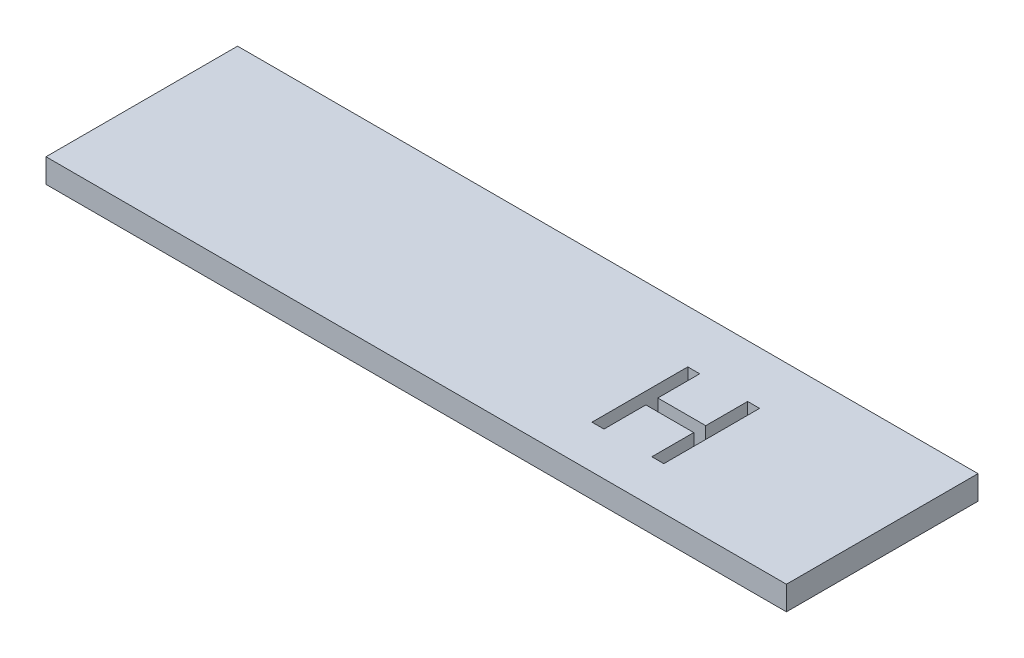
ISO-10303-21;
HEADER;
FILE_DESCRIPTION(('STEP AP214'),'2;1');
FILE_NAME('part.step','',(''),(''),'','','');
FILE_SCHEMA(('AUTOMOTIVE_DESIGN { 1 0 10303 214 1 1 1 1 }'));
ENDSEC;
DATA;
#1=APPLICATION_CONTEXT('core data for automotive mechanical design processes');
#2=APPLICATION_PROTOCOL_DEFINITION('international standard','automotive_design',2000,#1);
#3=PRODUCT_CONTEXT('',#1,'mechanical');
#4=PRODUCT('Part','Part','',(#3));
#5=PRODUCT_RELATED_PRODUCT_CATEGORY('part','',(#4));
#6=PRODUCT_DEFINITION_FORMATION('','',#4);
#7=PRODUCT_DEFINITION_CONTEXT('part definition',#1,'design');
#8=PRODUCT_DEFINITION('design','',#6,#7);
#9=PRODUCT_DEFINITION_SHAPE('','',#8);
#10=(LENGTH_UNIT() NAMED_UNIT(*) SI_UNIT(.MILLI.,.METRE.));
#11=(NAMED_UNIT(*) PLANE_ANGLE_UNIT() SI_UNIT($,.RADIAN.));
#12=(NAMED_UNIT(*) SI_UNIT($,.STERADIAN.) SOLID_ANGLE_UNIT());
#13=UNCERTAINTY_MEASURE_WITH_UNIT(LENGTH_MEASURE(1.E-05),#10,'distance_accuracy_value','');
#14=(GEOMETRIC_REPRESENTATION_CONTEXT(3) GLOBAL_UNCERTAINTY_ASSIGNED_CONTEXT((#13)) GLOBAL_UNIT_ASSIGNED_CONTEXT((#10,
#11,#12)) REPRESENTATION_CONTEXT('',''));
#15=CARTESIAN_POINT('',(0.,0.,0.));
#16=DIRECTION('',(0.,0.,1.));
#17=DIRECTION('',(1.,0.,0.));
#18=AXIS2_PLACEMENT_3D('',#15,#16,#17);
#19=CARTESIAN_POINT('',(0.,6.35,0.));
#20=DIRECTION('',(1.,0.,0.));
#21=DIRECTION('',(0.,0.,-1.));
#22=AXIS2_PLACEMENT_3D('',#19,#20,#21);
#23=PLANE('',#22);
#24=DIRECTION('',(0.,0.,1.));
#25=VECTOR('',#24,1.);
#26=CARTESIAN_POINT('',(0.,0.,0.));
#27=LINE('',#26,#25);
#28=CARTESIAN_POINT('',(0.,0.,-50.8));
#29=VERTEX_POINT('',#28);
#30=CARTESIAN_POINT('',(0.,0.,0.));
#31=VERTEX_POINT('',#30);
#32=EDGE_CURVE('E293',#29,#31,#27,.T.);
#33=ORIENTED_EDGE('',*,*,#32,.T.);
#34=DIRECTION('',(0.,-1.,0.));
#35=VECTOR('',#34,1.);
#36=CARTESIAN_POINT('',(0.,6.35,0.));
#37=LINE('',#36,#35);
#38=CARTESIAN_POINT('',(0.,6.35,0.));
#39=VERTEX_POINT('',#38);
#40=EDGE_CURVE('E11',#39,#31,#37,.T.);
#41=ORIENTED_EDGE('',*,*,#40,.F.);
#42=DIRECTION('',(0.,0.,1.));
#43=VECTOR('',#42,1.);
#44=CARTESIAN_POINT('',(0.,6.35,0.));
#45=LINE('',#44,#43);
#46=CARTESIAN_POINT('',(0.,6.35,-50.8));
#47=VERTEX_POINT('',#46);
#48=EDGE_CURVE('E294',#47,#39,#45,.T.);
#49=ORIENTED_EDGE('',*,*,#48,.F.);
#50=DIRECTION('',(0.,-1.,0.));
#51=VECTOR('',#50,1.);
#52=CARTESIAN_POINT('',(0.,6.35,-50.8));
#53=LINE('',#52,#51);
#54=EDGE_CURVE('E308',#47,#29,#53,.T.);
#55=ORIENTED_EDGE('',*,*,#54,.T.);
#56=EDGE_LOOP('',(#33,#41,#49,#55));
#57=FACE_BOUND('',#56,.T.);
#58=ADVANCED_FACE('F43',(#57),#23,.F.);
#59=CARTESIAN_POINT('',(0.,6.35,0.));
#60=DIRECTION('',(0.,0.,-1.));
#61=DIRECTION('',(-1.,0.,0.));
#62=AXIS2_PLACEMENT_3D('',#59,#60,#61);
#63=PLANE('',#62);
#64=DIRECTION('',(1.,0.,0.));
#65=VECTOR('',#64,1.);
#66=CARTESIAN_POINT('',(0.,0.,0.));
#67=LINE('',#66,#65);
#68=CARTESIAN_POINT('',(196.342,0.,0.));
#69=VERTEX_POINT('',#68);
#70=EDGE_CURVE('E312',#31,#69,#67,.T.);
#71=ORIENTED_EDGE('',*,*,#70,.T.);
#72=DIRECTION('',(0.,-1.,0.));
#73=VECTOR('',#72,1.);
#74=CARTESIAN_POINT('',(196.342,6.35,0.));
#75=LINE('',#74,#73);
#76=CARTESIAN_POINT('',(196.342,6.35,0.));
#77=VERTEX_POINT('',#76);
#78=EDGE_CURVE('E51',#77,#69,#75,.T.);
#79=ORIENTED_EDGE('',*,*,#78,.F.);
#80=DIRECTION('',(1.,0.,0.));
#81=VECTOR('',#80,1.);
#82=CARTESIAN_POINT('',(0.,6.35,0.));
#83=LINE('',#82,#81);
#84=EDGE_CURVE('E298',#39,#77,#83,.T.);
#85=ORIENTED_EDGE('',*,*,#84,.F.);
#86=ORIENTED_EDGE('',*,*,#40,.T.);
#87=EDGE_LOOP('',(#71,#79,#85,#86));
#88=FACE_BOUND('',#87,.T.);
#89=ADVANCED_FACE('F346',(#88),#63,.F.);
#90=CARTESIAN_POINT('',(196.342,6.35,0.));
#91=DIRECTION('',(-1.,0.,0.));
#92=DIRECTION('',(0.,0.,1.));
#93=AXIS2_PLACEMENT_3D('',#90,#91,#92);
#94=PLANE('',#93);
#95=DIRECTION('',(0.,0.,-1.));
#96=VECTOR('',#95,1.);
#97=CARTESIAN_POINT('',(196.342,0.,0.));
#98=LINE('',#97,#96);
#99=CARTESIAN_POINT('',(196.342,0.,-50.8));
#100=VERTEX_POINT('',#99);
#101=EDGE_CURVE('E315',#69,#100,#98,.T.);
#102=ORIENTED_EDGE('',*,*,#101,.T.);
#103=DIRECTION('',(0.,-1.,0.));
#104=VECTOR('',#103,1.);
#105=CARTESIAN_POINT('',(196.342,6.35,-50.8));
#106=LINE('',#105,#104);
#107=CARTESIAN_POINT('',(196.342,6.35,-50.8));
#108=VERTEX_POINT('',#107);
#109=EDGE_CURVE('E323',#108,#100,#106,.T.);
#110=ORIENTED_EDGE('',*,*,#109,.F.);
#111=DIRECTION('',(0.,0.,-1.));
#112=VECTOR('',#111,1.);
#113=CARTESIAN_POINT('',(196.342,6.35,0.));
#114=LINE('',#113,#112);
#115=EDGE_CURVE('E302',#77,#108,#114,.T.);
#116=ORIENTED_EDGE('',*,*,#115,.F.);
#117=ORIENTED_EDGE('',*,*,#78,.T.);
#118=EDGE_LOOP('',(#102,#110,#116,#117));
#119=FACE_BOUND('',#118,.T.);
#120=ADVANCED_FACE('F332',(#119),#94,.F.);
#121=CARTESIAN_POINT('',(0.,6.35,-50.8));
#122=DIRECTION('',(0.,0.,1.));
#123=DIRECTION('',(1.,0.,0.));
#124=AXIS2_PLACEMENT_3D('',#121,#122,#123);
#125=PLANE('',#124);
#126=DIRECTION('',(-1.,0.,0.));
#127=VECTOR('',#126,1.);
#128=CARTESIAN_POINT('',(0.,0.,-50.8));
#129=LINE('',#128,#127);
#130=EDGE_CURVE('E299',#100,#29,#129,.T.);
#131=ORIENTED_EDGE('',*,*,#130,.T.);
#132=ORIENTED_EDGE('',*,*,#54,.F.);
#133=DIRECTION('',(-1.,0.,0.));
#134=VECTOR('',#133,1.);
#135=CARTESIAN_POINT('',(0.,6.35,-50.8));
#136=LINE('',#135,#134);
#137=EDGE_CURVE('E305',#108,#47,#136,.T.);
#138=ORIENTED_EDGE('',*,*,#137,.F.);
#139=ORIENTED_EDGE('',*,*,#109,.T.);
#140=EDGE_LOOP('',(#131,#132,#138,#139));
#141=FACE_BOUND('',#140,.T.);
#142=ADVANCED_FACE('F339',(#141),#125,.F.);
#143=CARTESIAN_POINT('',(0.,6.35,0.));
#144=DIRECTION('',(0.,-1.,0.));
#145=DIRECTION('',(0.,0.,-1.));
#146=AXIS2_PLACEMENT_3D('',#143,#144,#145);
#147=PLANE('',#146);
#148=DIRECTION('',(-1.,0.,0.));
#149=VECTOR('',#148,1.);
#150=CARTESIAN_POINT('',(0.,6.35,-11.43));
#151=LINE('',#150,#149);
#152=CARTESIAN_POINT('',(136.525,6.35,-11.43));
#153=VERTEX_POINT('',#152);
#154=CARTESIAN_POINT('',(133.35,6.35,-11.43));
#155=VERTEX_POINT('',#154);
#156=EDGE_CURVE('E285',#153,#155,#151,.T.);
#157=ORIENTED_EDGE('',*,*,#156,.T.);
#158=DIRECTION('',(0.,0.,-1.));
#159=VECTOR('',#158,1.);
#160=CARTESIAN_POINT('',(133.35,6.35,0.));
#161=LINE('',#160,#159);
#162=CARTESIAN_POINT('',(133.35,6.35,-36.83));
#163=VERTEX_POINT('',#162);
#164=EDGE_CURVE('E289',#155,#163,#161,.T.);
#165=ORIENTED_EDGE('',*,*,#164,.T.);
#166=DIRECTION('',(1.,0.,0.));
#167=VECTOR('',#166,1.);
#168=CARTESIAN_POINT('',(0.,6.35,-36.83));
#169=LINE('',#168,#167);
#170=CARTESIAN_POINT('',(136.525,6.35,-36.83));
#171=VERTEX_POINT('',#170);
#172=EDGE_CURVE('E220',#163,#171,#169,.T.);
#173=ORIENTED_EDGE('',*,*,#172,.T.);
#174=DIRECTION('',(0.,0.,1.));
#175=VECTOR('',#174,1.);
#176=CARTESIAN_POINT('',(136.525,6.35,-3.40997071849155E-13));
#177=LINE('',#176,#175);
#178=CARTESIAN_POINT('',(136.525,6.35,-25.7175));
#179=VERTEX_POINT('',#178);
#180=EDGE_CURVE('E162',#171,#179,#177,.T.);
#181=ORIENTED_EDGE('',*,*,#180,.T.);
#182=DIRECTION('',(1.,0.,0.));
#183=VECTOR('',#182,1.);
#184=CARTESIAN_POINT('',(0.,6.35,-25.7175));
#185=LINE('',#184,#183);
#186=CARTESIAN_POINT('',(149.225,6.35,-25.7175));
#187=VERTEX_POINT('',#186);
#188=EDGE_CURVE('E253',#179,#187,#185,.T.);
#189=ORIENTED_EDGE('',*,*,#188,.T.);
#190=DIRECTION('',(0.,0.,-1.));
#191=VECTOR('',#190,1.);
#192=CARTESIAN_POINT('',(149.225,6.35,0.));
#193=LINE('',#192,#191);
#194=CARTESIAN_POINT('',(149.225,6.35,-36.83));
#195=VERTEX_POINT('',#194);
#196=EDGE_CURVE('E257',#187,#195,#193,.T.);
#197=ORIENTED_EDGE('',*,*,#196,.T.);
#198=DIRECTION('',(1.,0.,0.));
#199=VECTOR('',#198,1.);
#200=CARTESIAN_POINT('',(0.,6.35,-36.83));
#201=LINE('',#200,#199);
#202=CARTESIAN_POINT('',(152.4,6.35,-36.83));
#203=VERTEX_POINT('',#202);
#204=EDGE_CURVE('E261',#195,#203,#201,.T.);
#205=ORIENTED_EDGE('',*,*,#204,.T.);
#206=DIRECTION('',(0.,0.,1.));
#207=VECTOR('',#206,1.);
#208=CARTESIAN_POINT('',(152.4,6.35,0.));
#209=LINE('',#208,#207);
#210=CARTESIAN_POINT('',(152.4,6.35,-11.43));
#211=VERTEX_POINT('',#210);
#212=EDGE_CURVE('E265',#203,#211,#209,.T.);
#213=ORIENTED_EDGE('',*,*,#212,.T.);
#214=DIRECTION('',(-1.,0.,0.));
#215=VECTOR('',#214,1.);
#216=CARTESIAN_POINT('',(0.,6.35,-11.43));
#217=LINE('',#216,#215);
#218=CARTESIAN_POINT('',(149.225,6.35,-11.43));
#219=VERTEX_POINT('',#218);
#220=EDGE_CURVE('E269',#211,#219,#217,.T.);
#221=ORIENTED_EDGE('',*,*,#220,.T.);
#222=DIRECTION('',(0.,0.,-1.));
#223=VECTOR('',#222,1.);
#224=CARTESIAN_POINT('',(149.225,6.35,0.));
#225=LINE('',#224,#223);
#226=CARTESIAN_POINT('',(149.225,6.35,-22.5425));
#227=VERTEX_POINT('',#226);
#228=EDGE_CURVE('E273',#219,#227,#225,.T.);
#229=ORIENTED_EDGE('',*,*,#228,.T.);
#230=DIRECTION('',(-1.,0.,0.));
#231=VECTOR('',#230,1.);
#232=CARTESIAN_POINT('',(0.,6.35,-22.5425));
#233=LINE('',#232,#231);
#234=CARTESIAN_POINT('',(136.525,6.35,-22.5425));
#235=VERTEX_POINT('',#234);
#236=EDGE_CURVE('E277',#227,#235,#233,.T.);
#237=ORIENTED_EDGE('',*,*,#236,.T.);
#238=DIRECTION('',(0.,0.,1.));
#239=VECTOR('',#238,1.);
#240=CARTESIAN_POINT('',(136.525,6.35,-3.40997071849155E-13));
#241=LINE('',#240,#239);
#242=EDGE_CURVE('E281',#235,#153,#241,.T.);
#243=ORIENTED_EDGE('',*,*,#242,.T.);
#244=EDGE_LOOP('',(#157,#165,#173,#181,#189,#197,#205,#213,#221,#229,#237,#243));
#245=FACE_BOUND('',#244,.T.);
#246=ORIENTED_EDGE('',*,*,#48,.T.);
#247=ORIENTED_EDGE('',*,*,#84,.T.);
#248=ORIENTED_EDGE('',*,*,#115,.T.);
#249=ORIENTED_EDGE('',*,*,#137,.T.);
#250=EDGE_LOOP('',(#246,#247,#248,#249));
#251=FACE_BOUND('',#250,.T.);
#252=ADVANCED_FACE('F345',(#245,#251),#147,.F.);
#253=CARTESIAN_POINT('',(0.,0.,0.));
#254=DIRECTION('',(0.,-1.,0.));
#255=DIRECTION('',(0.,0.,-1.));
#256=AXIS2_PLACEMENT_3D('',#253,#254,#255);
#257=PLANE('',#256);
#258=DIRECTION('',(0.,0.,-1.));
#259=VECTOR('',#258,1.);
#260=CARTESIAN_POINT('',(133.35,0.,-11.43));
#261=LINE('',#260,#259);
#262=CARTESIAN_POINT('',(133.35,0.,-11.43));
#263=VERTEX_POINT('',#262);
#264=CARTESIAN_POINT('',(133.35,0.,-36.83));
#265=VERTEX_POINT('',#264);
#266=EDGE_CURVE('E66',#263,#265,#261,.T.);
#267=ORIENTED_EDGE('',*,*,#266,.F.);
#268=DIRECTION('',(-1.,0.,0.));
#269=VECTOR('',#268,1.);
#270=CARTESIAN_POINT('',(133.35,0.,-11.43));
#271=LINE('',#270,#269);
#272=CARTESIAN_POINT('',(136.525,0.,-11.43));
#273=VERTEX_POINT('',#272);
#274=EDGE_CURVE('E213',#273,#263,#271,.T.);
#275=ORIENTED_EDGE('',*,*,#274,.F.);
#276=DIRECTION('',(0.,0.,1.));
#277=VECTOR('',#276,1.);
#278=CARTESIAN_POINT('',(136.525,0.,-11.43));
#279=LINE('',#278,#277);
#280=CARTESIAN_POINT('',(136.525,0.,-22.5425));
#281=VERTEX_POINT('',#280);
#282=EDGE_CURVE('E209',#281,#273,#279,.T.);
#283=ORIENTED_EDGE('',*,*,#282,.F.);
#284=DIRECTION('',(-1.,0.,0.));
#285=VECTOR('',#284,1.);
#286=CARTESIAN_POINT('',(136.525,0.,-22.5425));
#287=LINE('',#286,#285);
#288=CARTESIAN_POINT('',(149.225,0.,-22.5425));
#289=VERTEX_POINT('',#288);
#290=EDGE_CURVE('E205',#289,#281,#287,.T.);
#291=ORIENTED_EDGE('',*,*,#290,.F.);
#292=DIRECTION('',(0.,0.,-1.));
#293=VECTOR('',#292,1.);
#294=CARTESIAN_POINT('',(149.225,0.,-11.43));
#295=LINE('',#294,#293);
#296=CARTESIAN_POINT('',(149.225,0.,-11.43));
#297=VERTEX_POINT('',#296);
#298=EDGE_CURVE('E201',#297,#289,#295,.T.);
#299=ORIENTED_EDGE('',*,*,#298,.F.);
#300=DIRECTION('',(-1.,0.,0.));
#301=VECTOR('',#300,1.);
#302=CARTESIAN_POINT('',(149.225,0.,-11.43));
#303=LINE('',#302,#301);
#304=CARTESIAN_POINT('',(152.4,0.,-11.43));
#305=VERTEX_POINT('',#304);
#306=EDGE_CURVE('E197',#305,#297,#303,.T.);
#307=ORIENTED_EDGE('',*,*,#306,.F.);
#308=DIRECTION('',(0.,0.,1.));
#309=VECTOR('',#308,1.);
#310=CARTESIAN_POINT('',(152.4,0.,-11.43));
#311=LINE('',#310,#309);
#312=CARTESIAN_POINT('',(152.4,0.,-36.83));
#313=VERTEX_POINT('',#312);
#314=EDGE_CURVE('E193',#313,#305,#311,.T.);
#315=ORIENTED_EDGE('',*,*,#314,.F.);
#316=DIRECTION('',(1.,0.,0.));
#317=VECTOR('',#316,1.);
#318=CARTESIAN_POINT('',(149.225,0.,-36.83));
#319=LINE('',#318,#317);
#320=CARTESIAN_POINT('',(149.225,0.,-36.83));
#321=VERTEX_POINT('',#320);
#322=EDGE_CURVE('E189',#321,#313,#319,.T.);
#323=ORIENTED_EDGE('',*,*,#322,.F.);
#324=DIRECTION('',(0.,0.,-1.));
#325=VECTOR('',#324,1.);
#326=CARTESIAN_POINT('',(149.225,0.,-25.7175));
#327=LINE('',#326,#325);
#328=CARTESIAN_POINT('',(149.225,0.,-25.7175));
#329=VERTEX_POINT('',#328);
#330=EDGE_CURVE('E182',#329,#321,#327,.T.);
#331=ORIENTED_EDGE('',*,*,#330,.F.);
#332=DIRECTION('',(1.,0.,0.));
#333=VECTOR('',#332,1.);
#334=CARTESIAN_POINT('',(136.525,0.,-25.7175));
#335=LINE('',#334,#333);
#336=CARTESIAN_POINT('',(136.525,0.,-25.7175));
#337=VERTEX_POINT('',#336);
#338=EDGE_CURVE('E178',#337,#329,#335,.T.);
#339=ORIENTED_EDGE('',*,*,#338,.F.);
#340=DIRECTION('',(0.,0.,1.));
#341=VECTOR('',#340,1.);
#342=CARTESIAN_POINT('',(136.525,0.,-25.7175));
#343=LINE('',#342,#341);
#344=CARTESIAN_POINT('',(136.525,0.,-36.83));
#345=VERTEX_POINT('',#344);
#346=EDGE_CURVE('E159',#345,#337,#343,.T.);
#347=ORIENTED_EDGE('',*,*,#346,.F.);
#348=DIRECTION('',(1.,0.,0.));
#349=VECTOR('',#348,1.);
#350=CARTESIAN_POINT('',(133.35,0.,-36.83));
#351=LINE('',#350,#349);
#352=EDGE_CURVE('E169',#265,#345,#351,.T.);
#353=ORIENTED_EDGE('',*,*,#352,.F.);
#354=EDGE_LOOP('',(#267,#275,#283,#291,#299,#307,#315,#323,#331,#339,#347,#353));
#355=FACE_BOUND('',#354,.T.);
#356=ORIENTED_EDGE('',*,*,#32,.F.);
#357=ORIENTED_EDGE('',*,*,#130,.F.);
#358=ORIENTED_EDGE('',*,*,#101,.F.);
#359=ORIENTED_EDGE('',*,*,#70,.F.);
#360=EDGE_LOOP('',(#356,#357,#358,#359));
#361=FACE_BOUND('',#360,.T.);
#362=ADVANCED_FACE('F174',(#355,#361),#257,.T.);
#363=CARTESIAN_POINT('',(133.35,7.62,-11.43));
#364=DIRECTION('',(-1.,0.,0.));
#365=DIRECTION('',(0.,0.,1.));
#366=AXIS2_PLACEMENT_3D('',#363,#364,#365);
#367=PLANE('',#366);
#368=DIRECTION('',(0.,-1.,0.));
#369=VECTOR('',#368,1.);
#370=CARTESIAN_POINT('',(133.35,7.62,-11.43));
#371=LINE('',#370,#369);
#372=EDGE_CURVE('E217',#155,#263,#371,.T.);
#373=ORIENTED_EDGE('',*,*,#372,.T.);
#374=ORIENTED_EDGE('',*,*,#266,.T.);
#375=DIRECTION('',(0.,-1.,0.));
#376=VECTOR('',#375,1.);
#377=CARTESIAN_POINT('',(133.35,7.62,-36.83));
#378=LINE('',#377,#376);
#379=EDGE_CURVE('E166',#163,#265,#378,.T.);
#380=ORIENTED_EDGE('',*,*,#379,.F.);
#381=ORIENTED_EDGE('',*,*,#164,.F.);
#382=EDGE_LOOP('',(#373,#374,#380,#381));
#383=FACE_BOUND('',#382,.T.);
#384=ADVANCED_FACE('F358',(#383),#367,.F.);
#385=CARTESIAN_POINT('',(133.35,7.62,-11.43));
#386=DIRECTION('',(0.,0.,1.));
#387=DIRECTION('',(1.,0.,0.));
#388=AXIS2_PLACEMENT_3D('',#385,#386,#387);
#389=PLANE('',#388);
#390=DIRECTION('',(0.,-1.,0.));
#391=VECTOR('',#390,1.);
#392=CARTESIAN_POINT('',(136.525,7.62,-11.43));
#393=LINE('',#392,#391);
#394=EDGE_CURVE('E221',#153,#273,#393,.T.);
#395=ORIENTED_EDGE('',*,*,#394,.T.);
#396=ORIENTED_EDGE('',*,*,#274,.T.);
#397=ORIENTED_EDGE('',*,*,#372,.F.);
#398=ORIENTED_EDGE('',*,*,#156,.F.);
#399=EDGE_LOOP('',(#395,#396,#397,#398));
#400=FACE_BOUND('',#399,.T.);
#401=ADVANCED_FACE('F364',(#400),#389,.F.);
#402=CARTESIAN_POINT('',(136.525,7.62,-11.43));
#403=DIRECTION('',(1.,0.,0.));
#404=DIRECTION('',(0.,0.,-1.));
#405=AXIS2_PLACEMENT_3D('',#402,#403,#404);
#406=PLANE('',#405);
#407=DIRECTION('',(0.,-1.,0.));
#408=VECTOR('',#407,1.);
#409=CARTESIAN_POINT('',(136.525,7.62,-22.5425));
#410=LINE('',#409,#408);
#411=EDGE_CURVE('E224',#235,#281,#410,.T.);
#412=ORIENTED_EDGE('',*,*,#411,.T.);
#413=ORIENTED_EDGE('',*,*,#282,.T.);
#414=ORIENTED_EDGE('',*,*,#394,.F.);
#415=ORIENTED_EDGE('',*,*,#242,.F.);
#416=EDGE_LOOP('',(#412,#413,#414,#415));
#417=FACE_BOUND('',#416,.T.);
#418=ADVANCED_FACE('F396',(#417),#406,.F.);
#419=CARTESIAN_POINT('',(136.525,7.62,-22.5425));
#420=DIRECTION('',(0.,0.,1.));
#421=DIRECTION('',(1.,0.,0.));
#422=AXIS2_PLACEMENT_3D('',#419,#420,#421);
#423=PLANE('',#422);
#424=DIRECTION('',(0.,-1.,0.));
#425=VECTOR('',#424,1.);
#426=CARTESIAN_POINT('',(149.225,7.62,-22.5425));
#427=LINE('',#426,#425);
#428=EDGE_CURVE('E227',#227,#289,#427,.T.);
#429=ORIENTED_EDGE('',*,*,#428,.T.);
#430=ORIENTED_EDGE('',*,*,#290,.T.);
#431=ORIENTED_EDGE('',*,*,#411,.F.);
#432=ORIENTED_EDGE('',*,*,#236,.F.);
#433=EDGE_LOOP('',(#429,#430,#431,#432));
#434=FACE_BOUND('',#433,.T.);
#435=ADVANCED_FACE('F392',(#434),#423,.F.);
#436=CARTESIAN_POINT('',(149.225,7.62,-11.43));
#437=DIRECTION('',(-1.,0.,0.));
#438=DIRECTION('',(0.,0.,1.));
#439=AXIS2_PLACEMENT_3D('',#436,#437,#438);
#440=PLANE('',#439);
#441=DIRECTION('',(0.,-1.,0.));
#442=VECTOR('',#441,1.);
#443=CARTESIAN_POINT('',(149.225,7.62,-11.43));
#444=LINE('',#443,#442);
#445=EDGE_CURVE('E230',#219,#297,#444,.T.);
#446=ORIENTED_EDGE('',*,*,#445,.T.);
#447=ORIENTED_EDGE('',*,*,#298,.T.);
#448=ORIENTED_EDGE('',*,*,#428,.F.);
#449=ORIENTED_EDGE('',*,*,#228,.F.);
#450=EDGE_LOOP('',(#446,#447,#448,#449));
#451=FACE_BOUND('',#450,.T.);
#452=ADVANCED_FACE('F388',(#451),#440,.F.);
#453=CARTESIAN_POINT('',(149.225,7.62,-11.43));
#454=DIRECTION('',(0.,0.,1.));
#455=DIRECTION('',(1.,0.,0.));
#456=AXIS2_PLACEMENT_3D('',#453,#454,#455);
#457=PLANE('',#456);
#458=DIRECTION('',(0.,-1.,0.));
#459=VECTOR('',#458,1.);
#460=CARTESIAN_POINT('',(152.4,7.62,-11.43));
#461=LINE('',#460,#459);
#462=EDGE_CURVE('E233',#211,#305,#461,.T.);
#463=ORIENTED_EDGE('',*,*,#462,.T.);
#464=ORIENTED_EDGE('',*,*,#306,.T.);
#465=ORIENTED_EDGE('',*,*,#445,.F.);
#466=ORIENTED_EDGE('',*,*,#220,.F.);
#467=EDGE_LOOP('',(#463,#464,#465,#466));
#468=FACE_BOUND('',#467,.T.);
#469=ADVANCED_FACE('F384',(#468),#457,.F.);
#470=CARTESIAN_POINT('',(152.4,7.62,-11.43));
#471=DIRECTION('',(1.,0.,0.));
#472=DIRECTION('',(0.,0.,-1.));
#473=AXIS2_PLACEMENT_3D('',#470,#471,#472);
#474=PLANE('',#473);
#475=DIRECTION('',(0.,-1.,0.));
#476=VECTOR('',#475,1.);
#477=CARTESIAN_POINT('',(152.4,7.62,-36.83));
#478=LINE('',#477,#476);
#479=EDGE_CURVE('E236',#203,#313,#478,.T.);
#480=ORIENTED_EDGE('',*,*,#479,.T.);
#481=ORIENTED_EDGE('',*,*,#314,.T.);
#482=ORIENTED_EDGE('',*,*,#462,.F.);
#483=ORIENTED_EDGE('',*,*,#212,.F.);
#484=EDGE_LOOP('',(#480,#481,#482,#483));
#485=FACE_BOUND('',#484,.T.);
#486=ADVANCED_FACE('F380',(#485),#474,.F.);
#487=CARTESIAN_POINT('',(149.225,7.62,-36.83));
#488=DIRECTION('',(0.,0.,-1.));
#489=DIRECTION('',(-1.,0.,0.));
#490=AXIS2_PLACEMENT_3D('',#487,#488,#489);
#491=PLANE('',#490);
#492=DIRECTION('',(0.,-1.,0.));
#493=VECTOR('',#492,1.);
#494=CARTESIAN_POINT('',(149.225,7.62,-36.83));
#495=LINE('',#494,#493);
#496=EDGE_CURVE('E239',#195,#321,#495,.T.);
#497=ORIENTED_EDGE('',*,*,#496,.T.);
#498=ORIENTED_EDGE('',*,*,#322,.T.);
#499=ORIENTED_EDGE('',*,*,#479,.F.);
#500=ORIENTED_EDGE('',*,*,#204,.F.);
#501=EDGE_LOOP('',(#497,#498,#499,#500));
#502=FACE_BOUND('',#501,.T.);
#503=ADVANCED_FACE('F376',(#502),#491,.F.);
#504=CARTESIAN_POINT('',(149.225,7.62,-25.7175));
#505=DIRECTION('',(-1.,0.,0.));
#506=DIRECTION('',(0.,0.,1.));
#507=AXIS2_PLACEMENT_3D('',#504,#505,#506);
#508=PLANE('',#507);
#509=DIRECTION('',(0.,-1.,0.));
#510=VECTOR('',#509,1.);
#511=CARTESIAN_POINT('',(149.225,7.62,-25.7175));
#512=LINE('',#511,#510);
#513=EDGE_CURVE('E242',#187,#329,#512,.T.);
#514=ORIENTED_EDGE('',*,*,#513,.T.);
#515=ORIENTED_EDGE('',*,*,#330,.T.);
#516=ORIENTED_EDGE('',*,*,#496,.F.);
#517=ORIENTED_EDGE('',*,*,#196,.F.);
#518=EDGE_LOOP('',(#514,#515,#516,#517));
#519=FACE_BOUND('',#518,.T.);
#520=ADVANCED_FACE('F372',(#519),#508,.F.);
#521=CARTESIAN_POINT('',(136.525,7.62,-25.7175));
#522=DIRECTION('',(0.,0.,-1.));
#523=DIRECTION('',(-1.,0.,0.));
#524=AXIS2_PLACEMENT_3D('',#521,#522,#523);
#525=PLANE('',#524);
#526=DIRECTION('',(0.,-1.,0.));
#527=VECTOR('',#526,1.);
#528=CARTESIAN_POINT('',(136.525,7.62,-25.7175));
#529=LINE('',#528,#527);
#530=EDGE_CURVE('E165',#179,#337,#529,.T.);
#531=ORIENTED_EDGE('',*,*,#530,.T.);
#532=ORIENTED_EDGE('',*,*,#338,.T.);
#533=ORIENTED_EDGE('',*,*,#513,.F.);
#534=ORIENTED_EDGE('',*,*,#188,.F.);
#535=EDGE_LOOP('',(#531,#532,#533,#534));
#536=FACE_BOUND('',#535,.T.);
#537=ADVANCED_FACE('F369',(#536),#525,.F.);
#538=CARTESIAN_POINT('',(136.525,7.62,-25.7175));
#539=DIRECTION('',(1.,0.,0.));
#540=DIRECTION('',(0.,0.,-1.));
#541=AXIS2_PLACEMENT_3D('',#538,#539,#540);
#542=PLANE('',#541);
#543=DIRECTION('',(0.,-1.,0.));
#544=VECTOR('',#543,1.);
#545=CARTESIAN_POINT('',(136.525,7.62,-36.83));
#546=LINE('',#545,#544);
#547=EDGE_CURVE('E58',#171,#345,#546,.T.);
#548=ORIENTED_EDGE('',*,*,#547,.T.);
#549=ORIENTED_EDGE('',*,*,#346,.T.);
#550=ORIENTED_EDGE('',*,*,#530,.F.);
#551=ORIENTED_EDGE('',*,*,#180,.F.);
#552=EDGE_LOOP('',(#548,#549,#550,#551));
#553=FACE_BOUND('',#552,.T.);
#554=ADVANCED_FACE('F156',(#553),#542,.F.);
#555=CARTESIAN_POINT('',(133.35,7.62,-36.83));
#556=DIRECTION('',(0.,0.,-1.));
#557=DIRECTION('',(-1.,0.,0.));
#558=AXIS2_PLACEMENT_3D('',#555,#556,#557);
#559=PLANE('',#558);
#560=ORIENTED_EDGE('',*,*,#379,.T.);
#561=ORIENTED_EDGE('',*,*,#352,.T.);
#562=ORIENTED_EDGE('',*,*,#547,.F.);
#563=ORIENTED_EDGE('',*,*,#172,.F.);
#564=EDGE_LOOP('',(#560,#561,#562,#563));
#565=FACE_BOUND('',#564,.T.);
#566=ADVANCED_FACE('F170',(#565),#559,.F.);
#567=CLOSED_SHELL('',(#58,#89,#120,#142,#252,#362,#384,#401,#418,#435,#452,#469,#486,#503,#520,
#537,#554,#566));
#568=MANIFOLD_SOLID_BREP('B2',#567);
#569=ADVANCED_BREP_SHAPE_REPRESENTATION('',(#18,#568),#14);
#570=SHAPE_DEFINITION_REPRESENTATION(#9,#569);
ENDSEC;
END-ISO-10303-21;
